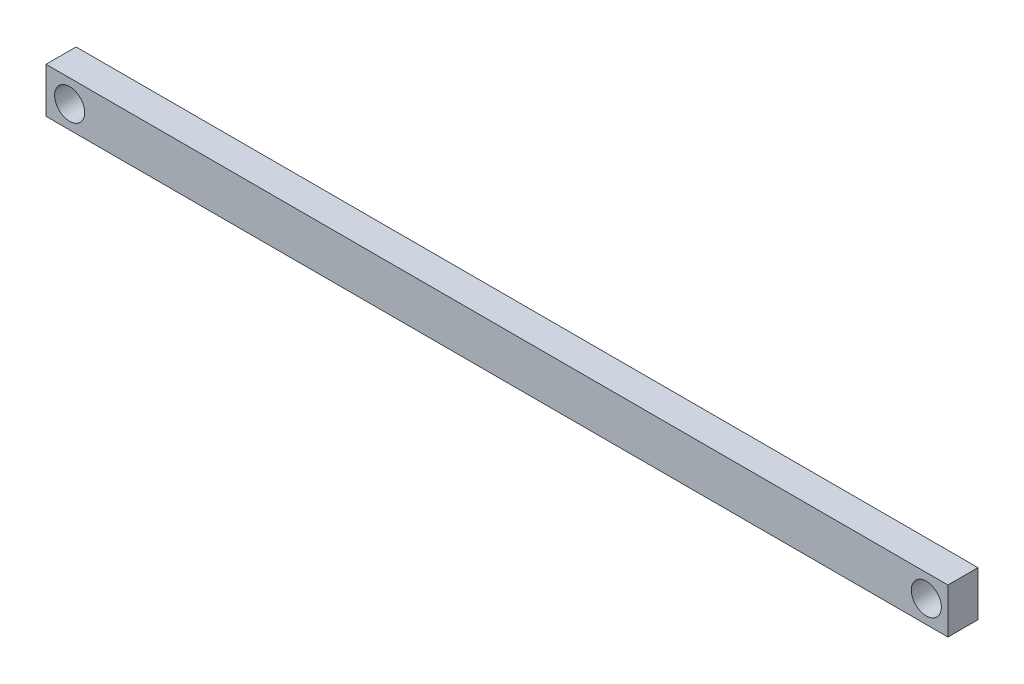
ISO-10303-21;
HEADER;
FILE_DESCRIPTION(('STEP AP214'),'2;1');
FILE_NAME('part.step','',(''),(''),'','','');
FILE_SCHEMA(('AUTOMOTIVE_DESIGN { 1 0 10303 214 1 1 1 1 }'));
ENDSEC;
DATA;
#1=APPLICATION_CONTEXT('core data for automotive mechanical design processes');
#2=APPLICATION_PROTOCOL_DEFINITION('international standard','automotive_design',2000,#1);
#3=PRODUCT_CONTEXT('',#1,'mechanical');
#4=PRODUCT('Part','Part','',(#3));
#5=PRODUCT_RELATED_PRODUCT_CATEGORY('part','',(#4));
#6=PRODUCT_DEFINITION_FORMATION('','',#4);
#7=PRODUCT_DEFINITION_CONTEXT('part definition',#1,'design');
#8=PRODUCT_DEFINITION('design','',#6,#7);
#9=PRODUCT_DEFINITION_SHAPE('','',#8);
#10=(LENGTH_UNIT() NAMED_UNIT(*) SI_UNIT(.MILLI.,.METRE.));
#11=(NAMED_UNIT(*) PLANE_ANGLE_UNIT() SI_UNIT($,.RADIAN.));
#12=(NAMED_UNIT(*) SI_UNIT($,.STERADIAN.) SOLID_ANGLE_UNIT());
#13=UNCERTAINTY_MEASURE_WITH_UNIT(LENGTH_MEASURE(1.E-05),#10,'distance_accuracy_value','');
#14=(GEOMETRIC_REPRESENTATION_CONTEXT(3) GLOBAL_UNCERTAINTY_ASSIGNED_CONTEXT((#13)) GLOBAL_UNIT_ASSIGNED_CONTEXT((#10,
#11,#12)) REPRESENTATION_CONTEXT('',''));
#15=CARTESIAN_POINT('',(0.,0.,0.));
#16=DIRECTION('',(0.,0.,1.));
#17=DIRECTION('',(1.,0.,0.));
#18=AXIS2_PLACEMENT_3D('',#15,#16,#17);
#19=CARTESIAN_POINT('',(0.,0.,10.));
#20=DIRECTION('',(0.,0.,1.));
#21=DIRECTION('',(1.,0.,0.));
#22=AXIS2_PLACEMENT_3D('',#19,#20,#21);
#23=PLANE('',#22);
#24=CARTESIAN_POINT('',(-50.278670722347,13.8721231991863,10.));
#25=DIRECTION('',(0.,0.,1.));
#26=DIRECTION('',(1.,0.,0.));
#27=AXIS2_PLACEMENT_3D('',#24,#25,#26);
#28=CIRCLE('',#27,5.);
#29=CARTESIAN_POINT('',(-45.278670722347,13.8721231991863,10.));
#30=VERTEX_POINT('',#29);
#31=EDGE_CURVE('E106',#30,#30,#28,.T.);
#32=ORIENTED_EDGE('',*,*,#31,.F.);
#33=EDGE_LOOP('',(#32));
#34=FACE_BOUND('',#33,.T.);
#35=DIRECTION('',(0.,-1.,0.));
#36=VECTOR('',#35,1.);
#37=CARTESIAN_POINT('',(-58.1347130227137,21.3721231991863,10.));
#38=LINE('',#37,#36);
#39=CARTESIAN_POINT('',(-58.1347130227137,21.3721231991863,10.));
#40=VERTEX_POINT('',#39);
#41=CARTESIAN_POINT('',(-58.1347130227137,6.37212319918633,10.));
#42=VERTEX_POINT('',#41);
#43=EDGE_CURVE('E91',#40,#42,#38,.T.);
#44=ORIENTED_EDGE('',*,*,#43,.T.);
#45=DIRECTION('',(1.,0.,0.));
#46=VECTOR('',#45,1.);
#47=CARTESIAN_POINT('',(-58.1347130227137,6.37212319918633,10.));
#48=LINE('',#47,#46);
#49=CARTESIAN_POINT('',(241.865286977286,6.37212319918633,10.));
#50=VERTEX_POINT('',#49);
#51=EDGE_CURVE('E86',#42,#50,#48,.T.);
#52=ORIENTED_EDGE('',*,*,#51,.T.);
#53=DIRECTION('',(0.,1.,0.));
#54=VECTOR('',#53,1.);
#55=CARTESIAN_POINT('',(241.865286977286,21.3721231991863,10.));
#56=LINE('',#55,#54);
#57=CARTESIAN_POINT('',(241.865286977286,21.3721231991863,10.));
#58=VERTEX_POINT('',#57);
#59=EDGE_CURVE('E89',#50,#58,#56,.T.);
#60=ORIENTED_EDGE('',*,*,#59,.T.);
#61=DIRECTION('',(-1.,0.,0.));
#62=VECTOR('',#61,1.);
#63=CARTESIAN_POINT('',(-58.1347130227137,21.3721231991863,10.));
#64=LINE('',#63,#62);
#65=EDGE_CURVE('E56',#58,#40,#64,.T.);
#66=ORIENTED_EDGE('',*,*,#65,.T.);
#67=EDGE_LOOP('',(#44,#52,#60,#66));
#68=FACE_BOUND('',#67,.T.);
#69=CARTESIAN_POINT('',(234.676155154191,13.8721231991863,10.));
#70=DIRECTION('',(0.,0.,1.));
#71=DIRECTION('',(1.,0.,0.));
#72=AXIS2_PLACEMENT_3D('',#69,#70,#71);
#73=CIRCLE('',#72,4.99999999999999);
#74=CARTESIAN_POINT('',(239.676155154191,13.8721231991863,10.));
#75=VERTEX_POINT('',#74);
#76=EDGE_CURVE('E121',#75,#75,#73,.T.);
#77=ORIENTED_EDGE('',*,*,#76,.F.);
#78=EDGE_LOOP('',(#77));
#79=FACE_BOUND('',#78,.T.);
#80=ADVANCED_FACE('F39',(#34,#68,#79),#23,.T.);
#81=CARTESIAN_POINT('',(0.,0.,0.));
#82=DIRECTION('',(0.,0.,1.));
#83=DIRECTION('',(1.,0.,0.));
#84=AXIS2_PLACEMENT_3D('',#81,#82,#83);
#85=PLANE('',#84);
#86=DIRECTION('',(0.,-1.,0.));
#87=VECTOR('',#86,1.);
#88=CARTESIAN_POINT('',(-58.1347130227137,21.3721231991863,0.));
#89=LINE('',#88,#87);
#90=CARTESIAN_POINT('',(-58.1347130227137,21.3721231991863,0.));
#91=VERTEX_POINT('',#90);
#92=CARTESIAN_POINT('',(-58.1347130227137,6.37212319918633,0.));
#93=VERTEX_POINT('',#92);
#94=EDGE_CURVE('E103',#91,#93,#89,.T.);
#95=ORIENTED_EDGE('',*,*,#94,.F.);
#96=DIRECTION('',(-1.,0.,0.));
#97=VECTOR('',#96,1.);
#98=CARTESIAN_POINT('',(-58.1347130227137,21.3721231991863,0.));
#99=LINE('',#98,#97);
#100=CARTESIAN_POINT('',(241.865286977286,21.3721231991863,0.));
#101=VERTEX_POINT('',#100);
#102=EDGE_CURVE('E79',#101,#91,#99,.T.);
#103=ORIENTED_EDGE('',*,*,#102,.F.);
#104=DIRECTION('',(0.,1.,0.));
#105=VECTOR('',#104,1.);
#106=CARTESIAN_POINT('',(241.865286977286,21.3721231991863,0.));
#107=LINE('',#106,#105);
#108=CARTESIAN_POINT('',(241.865286977286,6.37212319918633,0.));
#109=VERTEX_POINT('',#108);
#110=EDGE_CURVE('E73',#109,#101,#107,.T.);
#111=ORIENTED_EDGE('',*,*,#110,.F.);
#112=DIRECTION('',(1.,0.,0.));
#113=VECTOR('',#112,1.);
#114=CARTESIAN_POINT('',(-58.1347130227137,6.37212319918633,0.));
#115=LINE('',#114,#113);
#116=EDGE_CURVE('E95',#93,#109,#115,.T.);
#117=ORIENTED_EDGE('',*,*,#116,.F.);
#118=EDGE_LOOP('',(#95,#103,#111,#117));
#119=FACE_BOUND('',#118,.T.);
#120=CARTESIAN_POINT('',(-50.278670722347,13.8721231991863,0.));
#121=DIRECTION('',(0.,0.,1.));
#122=DIRECTION('',(1.,0.,0.));
#123=AXIS2_PLACEMENT_3D('',#120,#121,#122);
#124=CIRCLE('',#123,5.);
#125=CARTESIAN_POINT('',(-45.278670722347,13.8721231991863,0.));
#126=VERTEX_POINT('',#125);
#127=EDGE_CURVE('E118',#126,#126,#124,.T.);
#128=ORIENTED_EDGE('',*,*,#127,.T.);
#129=EDGE_LOOP('',(#128));
#130=FACE_BOUND('',#129,.T.);
#131=CARTESIAN_POINT('',(234.676155154191,13.8721231991863,0.));
#132=DIRECTION('',(0.,0.,1.));
#133=DIRECTION('',(1.,0.,0.));
#134=AXIS2_PLACEMENT_3D('',#131,#132,#133);
#135=CIRCLE('',#134,4.99999999999999);
#136=CARTESIAN_POINT('',(239.676155154191,13.8721231991863,0.));
#137=VERTEX_POINT('',#136);
#138=EDGE_CURVE('E124',#137,#137,#135,.T.);
#139=ORIENTED_EDGE('',*,*,#138,.T.);
#140=EDGE_LOOP('',(#139));
#141=FACE_BOUND('',#140,.T.);
#142=ADVANCED_FACE('F114',(#119,#130,#141),#85,.F.);
#143=CARTESIAN_POINT('',(-58.1347130227137,21.3721231991863,10.));
#144=DIRECTION('',(1.,0.,0.));
#145=DIRECTION('',(0.,0.,-1.));
#146=AXIS2_PLACEMENT_3D('',#143,#144,#145);
#147=PLANE('',#146);
#148=ORIENTED_EDGE('',*,*,#94,.T.);
#149=DIRECTION('',(0.,0.,-1.));
#150=VECTOR('',#149,1.);
#151=CARTESIAN_POINT('',(-58.1347130227137,6.37212319918633,10.));
#152=LINE('',#151,#150);
#153=EDGE_CURVE('E11',#42,#93,#152,.T.);
#154=ORIENTED_EDGE('',*,*,#153,.F.);
#155=ORIENTED_EDGE('',*,*,#43,.F.);
#156=DIRECTION('',(0.,0.,-1.));
#157=VECTOR('',#156,1.);
#158=CARTESIAN_POINT('',(-58.1347130227137,21.3721231991863,10.));
#159=LINE('',#158,#157);
#160=EDGE_CURVE('E99',#40,#91,#159,.T.);
#161=ORIENTED_EDGE('',*,*,#160,.T.);
#162=EDGE_LOOP('',(#148,#154,#155,#161));
#163=FACE_BOUND('',#162,.T.);
#164=ADVANCED_FACE('F41',(#163),#147,.F.);
#165=CARTESIAN_POINT('',(-58.1347130227137,6.37212319918633,10.));
#166=DIRECTION('',(0.,1.,0.));
#167=DIRECTION('',(0.,0.,1.));
#168=AXIS2_PLACEMENT_3D('',#165,#166,#167);
#169=PLANE('',#168);
#170=ORIENTED_EDGE('',*,*,#116,.T.);
#171=DIRECTION('',(0.,0.,-1.));
#172=VECTOR('',#171,1.);
#173=CARTESIAN_POINT('',(241.865286977286,6.37212319918633,10.));
#174=LINE('',#173,#172);
#175=EDGE_CURVE('E48',#50,#109,#174,.T.);
#176=ORIENTED_EDGE('',*,*,#175,.F.);
#177=ORIENTED_EDGE('',*,*,#51,.F.);
#178=ORIENTED_EDGE('',*,*,#153,.T.);
#179=EDGE_LOOP('',(#170,#176,#177,#178));
#180=FACE_BOUND('',#179,.T.);
#181=ADVANCED_FACE('F94',(#180),#169,.F.);
#182=CARTESIAN_POINT('',(241.865286977286,21.3721231991863,10.));
#183=DIRECTION('',(-1.,0.,0.));
#184=DIRECTION('',(0.,0.,1.));
#185=AXIS2_PLACEMENT_3D('',#182,#183,#184);
#186=PLANE('',#185);
#187=ORIENTED_EDGE('',*,*,#110,.T.);
#188=DIRECTION('',(0.,0.,-1.));
#189=VECTOR('',#188,1.);
#190=CARTESIAN_POINT('',(241.865286977286,21.3721231991863,10.));
#191=LINE('',#190,#189);
#192=EDGE_CURVE('E96',#58,#101,#191,.T.);
#193=ORIENTED_EDGE('',*,*,#192,.F.);
#194=ORIENTED_EDGE('',*,*,#59,.F.);
#195=ORIENTED_EDGE('',*,*,#175,.T.);
#196=EDGE_LOOP('',(#187,#193,#194,#195));
#197=FACE_BOUND('',#196,.T.);
#198=ADVANCED_FACE('F97',(#197),#186,.F.);
#199=CARTESIAN_POINT('',(-58.1347130227137,21.3721231991863,10.));
#200=DIRECTION('',(0.,-1.,0.));
#201=DIRECTION('',(0.,0.,-1.));
#202=AXIS2_PLACEMENT_3D('',#199,#200,#201);
#203=PLANE('',#202);
#204=ORIENTED_EDGE('',*,*,#102,.T.);
#205=ORIENTED_EDGE('',*,*,#160,.F.);
#206=ORIENTED_EDGE('',*,*,#65,.F.);
#207=ORIENTED_EDGE('',*,*,#192,.T.);
#208=EDGE_LOOP('',(#204,#205,#206,#207));
#209=FACE_BOUND('',#208,.T.);
#210=ADVANCED_FACE('F111',(#209),#203,.F.);
#211=CARTESIAN_POINT('',(-50.278670722347,13.8721231991863,10.));
#212=DIRECTION('',(0.,0.,-1.));
#213=DIRECTION('',(-1.,0.,0.));
#214=AXIS2_PLACEMENT_3D('',#211,#212,#213);
#215=CYLINDRICAL_SURFACE('',#214,5.);
#216=ORIENTED_EDGE('',*,*,#31,.T.);
#217=EDGE_LOOP('',(#216));
#218=FACE_BOUND('',#217,.T.);
#219=ORIENTED_EDGE('',*,*,#127,.F.);
#220=EDGE_LOOP('',(#219));
#221=FACE_BOUND('',#220,.T.);
#222=ADVANCED_FACE('F141',(#218,#221),#215,.F.);
#223=CARTESIAN_POINT('',(234.676155154191,13.8721231991863,10.));
#224=DIRECTION('',(0.,0.,-1.));
#225=DIRECTION('',(-1.,0.,0.));
#226=AXIS2_PLACEMENT_3D('',#223,#224,#225);
#227=CYLINDRICAL_SURFACE('',#226,4.99999999999999);
#228=ORIENTED_EDGE('',*,*,#76,.T.);
#229=EDGE_LOOP('',(#228));
#230=FACE_BOUND('',#229,.T.);
#231=ORIENTED_EDGE('',*,*,#138,.F.);
#232=EDGE_LOOP('',(#231));
#233=FACE_BOUND('',#232,.T.);
#234=ADVANCED_FACE('F130',(#230,#233),#227,.F.);
#235=CLOSED_SHELL('',(#80,#142,#164,#181,#198,#210,#222,#234));
#236=MANIFOLD_SOLID_BREP('B2',#235);
#237=ADVANCED_BREP_SHAPE_REPRESENTATION('',(#18,#236),#14);
#238=SHAPE_DEFINITION_REPRESENTATION(#9,#237);
ENDSEC;
END-ISO-10303-21;
